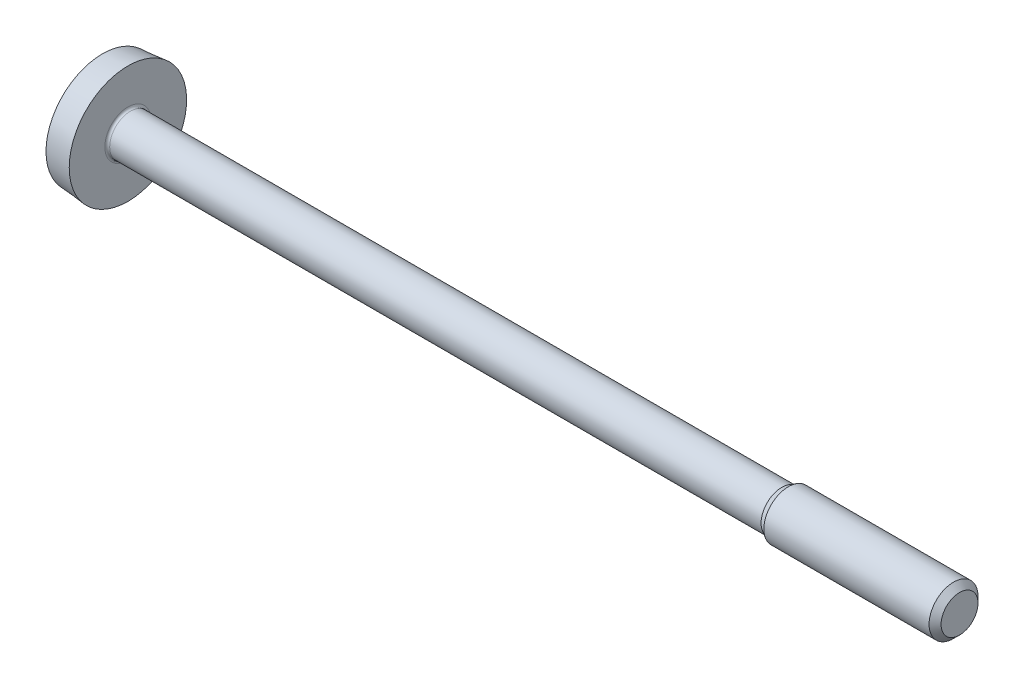
ISO-10303-21;
HEADER;
FILE_DESCRIPTION(('STEP AP214'),'2;1');
FILE_NAME('part.step','',(''),(''),'','','');
FILE_SCHEMA(('AUTOMOTIVE_DESIGN { 1 0 10303 214 1 1 1 1 }'));
ENDSEC;
DATA;
#1=APPLICATION_CONTEXT('core data for automotive mechanical design processes');
#2=APPLICATION_PROTOCOL_DEFINITION('international standard','automotive_design',2000,#1);
#3=PRODUCT_CONTEXT('',#1,'mechanical');
#4=PRODUCT('Part','Part','',(#3));
#5=PRODUCT_RELATED_PRODUCT_CATEGORY('part','',(#4));
#6=PRODUCT_DEFINITION_FORMATION('','',#4);
#7=PRODUCT_DEFINITION_CONTEXT('part definition',#1,'design');
#8=PRODUCT_DEFINITION('design','',#6,#7);
#9=PRODUCT_DEFINITION_SHAPE('','',#8);
#10=(LENGTH_UNIT() NAMED_UNIT(*) SI_UNIT(.MILLI.,.METRE.));
#11=(NAMED_UNIT(*) PLANE_ANGLE_UNIT() SI_UNIT($,.RADIAN.));
#12=(NAMED_UNIT(*) SI_UNIT($,.STERADIAN.) SOLID_ANGLE_UNIT());
#13=UNCERTAINTY_MEASURE_WITH_UNIT(LENGTH_MEASURE(1.E-05),#10,'distance_accuracy_value','');
#14=(GEOMETRIC_REPRESENTATION_CONTEXT(3) GLOBAL_UNCERTAINTY_ASSIGNED_CONTEXT((#13)) GLOBAL_UNIT_ASSIGNED_CONTEXT((#10,
#11,#12)) REPRESENTATION_CONTEXT('',''));
#15=CARTESIAN_POINT('',(0.,0.,0.));
#16=DIRECTION('',(0.,0.,1.));
#17=DIRECTION('',(1.,0.,0.));
#18=AXIS2_PLACEMENT_3D('',#15,#16,#17);
#19=CARTESIAN_POINT('',(3.44029950540036,2.63786388565723E-13,0.));
#20=DIRECTION('',(-1.,0.,0.));
#21=DIRECTION('',(0.,1.,0.));
#22=AXIS2_PLACEMENT_3D('',#19,#20,#21);
#23=SPHERICAL_SURFACE('',#22,5.04029950540036);
#24=CARTESIAN_POINT('',(3.44029950540036,0.29,0.));
#25=DIRECTION('',(0.,1.,0.));
#26=DIRECTION('',(0.,0.,1.));
#27=AXIS2_PLACEMENT_3D('',#24,#25,#26);
#28=CIRCLE('',#27,5.03194983124228);
#29=CARTESIAN_POINT('',(-1.49128432782597,0.29,-1.));
#30=VERTEX_POINT('',#29);
#31=CARTESIAN_POINT('',(-1.58328677375712,0.29,-0.29));
#32=VERTEX_POINT('',#31);
#33=EDGE_CURVE('E11',#30,#32,#28,.T.);
#34=ORIENTED_EDGE('',*,*,#33,.T.);
#35=CARTESIAN_POINT('',(3.44029950540036,2.63786388565723E-13,-0.29));
#36=DIRECTION('',(0.,0.,-1.));
#37=DIRECTION('',(-1.,0.,0.));
#38=AXIS2_PLACEMENT_3D('',#35,#36,#37);
#39=CIRCLE('',#38,5.03194983124227);
#40=CARTESIAN_POINT('',(-1.04,2.29072814756566,-0.29));
#41=VERTEX_POINT('',#40);
#42=EDGE_CURVE('E178',#32,#41,#39,.T.);
#43=ORIENTED_EDGE('',*,*,#42,.T.);
#44=CARTESIAN_POINT('',(-1.04,0.,0.));
#45=DIRECTION('',(-1.,0.,0.));
#46=DIRECTION('',(0.,0.,1.));
#47=AXIS2_PLACEMENT_3D('',#44,#45,#46);
#48=CIRCLE('',#47,2.309011789933);
#49=CARTESIAN_POINT('',(-1.04,-2.29072814756566,-0.29));
#50=VERTEX_POINT('',#49);
#51=EDGE_CURVE('E208',#41,#50,#48,.T.);
#52=ORIENTED_EDGE('',*,*,#51,.T.);
#53=CARTESIAN_POINT('',(3.44029950540036,2.63786388565723E-13,-0.29));
#54=DIRECTION('',(0.,0.,-1.));
#55=DIRECTION('',(-1.,0.,0.));
#56=AXIS2_PLACEMENT_3D('',#53,#54,#55);
#57=CIRCLE('',#56,5.03194983124227);
#58=CARTESIAN_POINT('',(-1.58328677375709,-0.29,-0.29));
#59=VERTEX_POINT('',#58);
#60=EDGE_CURVE('E175',#50,#59,#57,.T.);
#61=ORIENTED_EDGE('',*,*,#60,.T.);
#62=CARTESIAN_POINT('',(3.44029950540036,-0.29,0.));
#63=DIRECTION('',(0.,-1.,0.));
#64=DIRECTION('',(0.,0.,-1.));
#65=AXIS2_PLACEMENT_3D('',#62,#63,#64);
#66=CIRCLE('',#65,5.03194983124225);
#67=CARTESIAN_POINT('',(-1.49128432782594,-0.29,-1.));
#68=VERTEX_POINT('',#67);
#69=EDGE_CURVE('E215',#59,#68,#66,.T.);
#70=ORIENTED_EDGE('',*,*,#69,.T.);
#71=CARTESIAN_POINT('',(3.44029950540036,2.63786388565723E-13,-1.));
#72=DIRECTION('',(0.,0.,-1.));
#73=DIRECTION('',(-1.,0.,0.));
#74=AXIS2_PLACEMENT_3D('',#71,#72,#73);
#75=CIRCLE('',#74,4.94010314711536);
#76=EDGE_CURVE('E44',#68,#30,#75,.T.);
#77=ORIENTED_EDGE('',*,*,#76,.T.);
#78=EDGE_LOOP('',(#34,#43,#52,#61,#70,#77));
#79=FACE_BOUND('',#78,.T.);
#80=ADVANCED_FACE('F36',(#79),#23,.T.);
#81=CARTESIAN_POINT('',(-1.04,-2.29072814756566,0.29));
#82=VERTEX_POINT('',#81);
#83=CARTESIAN_POINT('',(-1.04,2.29072814756566,0.29));
#84=VERTEX_POINT('',#83);
#85=EDGE_CURVE('E205',#82,#84,#48,.T.);
#86=ORIENTED_EDGE('',*,*,#85,.T.);
#87=CARTESIAN_POINT('',(3.44029950540036,2.63786388565723E-13,0.29));
#88=DIRECTION('',(0.,0.,1.));
#89=DIRECTION('',(1.,0.,0.));
#90=AXIS2_PLACEMENT_3D('',#87,#88,#89);
#91=CIRCLE('',#90,5.03194983124227);
#92=CARTESIAN_POINT('',(-1.58328677375712,0.29,0.29));
#93=VERTEX_POINT('',#92);
#94=EDGE_CURVE('E181',#84,#93,#91,.T.);
#95=ORIENTED_EDGE('',*,*,#94,.T.);
#96=CARTESIAN_POINT('',(3.44029950540036,0.29,0.));
#97=DIRECTION('',(0.,1.,0.));
#98=DIRECTION('',(0.,0.,1.));
#99=AXIS2_PLACEMENT_3D('',#96,#97,#98);
#100=CIRCLE('',#99,5.03194983124228);
#101=CARTESIAN_POINT('',(-1.49128432782597,0.29,1.));
#102=VERTEX_POINT('',#101);
#103=EDGE_CURVE('E213',#93,#102,#100,.T.);
#104=ORIENTED_EDGE('',*,*,#103,.T.);
#105=CARTESIAN_POINT('',(3.44029950540036,2.63786388565723E-13,1.));
#106=DIRECTION('',(0.,0.,1.));
#107=DIRECTION('',(1.,0.,0.));
#108=AXIS2_PLACEMENT_3D('',#105,#106,#107);
#109=CIRCLE('',#108,4.94010314711536);
#110=CARTESIAN_POINT('',(-1.49128432782593,-0.29,1.));
#111=VERTEX_POINT('',#110);
#112=EDGE_CURVE('E119',#102,#111,#109,.T.);
#113=ORIENTED_EDGE('',*,*,#112,.T.);
#114=CARTESIAN_POINT('',(3.44029950540036,-0.29,0.));
#115=DIRECTION('',(0.,-1.,0.));
#116=DIRECTION('',(0.,0.,-1.));
#117=AXIS2_PLACEMENT_3D('',#114,#115,#116);
#118=CIRCLE('',#117,5.03194983124225);
#119=CARTESIAN_POINT('',(-1.58328677375709,-0.29,0.29));
#120=VERTEX_POINT('',#119);
#121=EDGE_CURVE('E210',#111,#120,#118,.T.);
#122=ORIENTED_EDGE('',*,*,#121,.T.);
#123=CARTESIAN_POINT('',(3.44029950540036,2.63786388565723E-13,0.29));
#124=DIRECTION('',(0.,0.,1.));
#125=DIRECTION('',(1.,0.,0.));
#126=AXIS2_PLACEMENT_3D('',#123,#124,#125);
#127=CIRCLE('',#126,5.03194983124227);
#128=EDGE_CURVE('E161',#120,#82,#127,.T.);
#129=ORIENTED_EDGE('',*,*,#128,.T.);
#130=EDGE_LOOP('',(#86,#95,#104,#113,#122,#129));
#131=FACE_BOUND('',#130,.T.);
#132=ADVANCED_FACE('F38',(#131),#23,.T.);
#133=CARTESIAN_POINT('',(0.,0.,0.));
#134=DIRECTION('',(1.,0.,0.));
#135=DIRECTION('',(0.,0.,-1.));
#136=AXIS2_PLACEMENT_3D('',#133,#134,#135);
#137=CONICAL_SURFACE('',#136,2.4,0.0872664625997538);
#138=EDGE_CURVE('E206',#84,#41,#48,.T.);
#139=ORIENTED_EDGE('',*,*,#138,.F.);
#140=ORIENTED_EDGE('',*,*,#85,.F.);
#141=EDGE_CURVE('E238',#50,#82,#48,.T.);
#142=ORIENTED_EDGE('',*,*,#141,.F.);
#143=ORIENTED_EDGE('',*,*,#51,.F.);
#144=EDGE_LOOP('',(#139,#140,#142,#143));
#145=FACE_BOUND('',#144,.T.);
#146=CARTESIAN_POINT('',(0.,0.,0.));
#147=DIRECTION('',(-1.,0.,0.));
#148=DIRECTION('',(0.,0.,1.));
#149=AXIS2_PLACEMENT_3D('',#146,#147,#148);
#150=CIRCLE('',#149,2.4);
#151=CARTESIAN_POINT('',(0.,0.,2.4));
#152=VERTEX_POINT('',#151);
#153=EDGE_CURVE('E202',#152,#152,#150,.T.);
#154=ORIENTED_EDGE('',*,*,#153,.T.);
#155=EDGE_LOOP('',(#154));
#156=FACE_BOUND('',#155,.T.);
#157=ADVANCED_FACE('F235',(#145,#156),#137,.T.);
#158=CARTESIAN_POINT('',(0.,2.4,0.));
#159=DIRECTION('',(-1.,0.,0.));
#160=DIRECTION('',(0.,0.,1.));
#161=AXIS2_PLACEMENT_3D('',#158,#159,#160);
#162=PLANE('',#161);
#163=ORIENTED_EDGE('',*,*,#153,.F.);
#164=EDGE_LOOP('',(#163));
#165=FACE_BOUND('',#164,.T.);
#166=CARTESIAN_POINT('',(0.,0.,0.));
#167=DIRECTION('',(-1.,0.,0.));
#168=DIRECTION('',(0.,0.,1.));
#169=AXIS2_PLACEMENT_3D('',#166,#167,#168);
#170=CIRCLE('',#169,0.945);
#171=CARTESIAN_POINT('',(0.,0.,0.945));
#172=VERTEX_POINT('',#171);
#173=EDGE_CURVE('E199',#172,#172,#170,.T.);
#174=ORIENTED_EDGE('',*,*,#173,.T.);
#175=EDGE_LOOP('',(#174));
#176=FACE_BOUND('',#175,.T.);
#177=ADVANCED_FACE('F265',(#165,#176),#162,.F.);
#178=CARTESIAN_POINT('',(0.100000000000008,0.,0.));
#179=DIRECTION('',(-1.,0.,0.));
#180=DIRECTION('',(0.,0.,1.));
#181=AXIS2_PLACEMENT_3D('',#178,#179,#180);
#182=TOROIDAL_SURFACE('',#181,0.945000000000008,0.100000000000008);
#183=ORIENTED_EDGE('',*,*,#173,.F.);
#184=EDGE_LOOP('',(#183));
#185=FACE_BOUND('',#184,.T.);
#186=CARTESIAN_POINT('',(0.100000000000003,0.,0.));
#187=DIRECTION('',(-1.,0.,0.));
#188=DIRECTION('',(0.,0.,1.));
#189=AXIS2_PLACEMENT_3D('',#186,#187,#188);
#190=CIRCLE('',#189,0.845);
#191=CARTESIAN_POINT('',(0.100000000000003,0.,0.845));
#192=VERTEX_POINT('',#191);
#193=EDGE_CURVE('E196',#192,#192,#190,.T.);
#194=ORIENTED_EDGE('',*,*,#193,.T.);
#195=EDGE_LOOP('',(#194));
#196=FACE_BOUND('',#195,.T.);
#197=ADVANCED_FACE('F269',(#185,#196),#182,.F.);
#198=CARTESIAN_POINT('',(34.,0.,0.));
#199=DIRECTION('',(-1.,0.,0.));
#200=DIRECTION('',(0.,0.,1.));
#201=AXIS2_PLACEMENT_3D('',#198,#199,#200);
#202=CYLINDRICAL_SURFACE('',#201,0.845);
#203=ORIENTED_EDGE('',*,*,#193,.F.);
#204=EDGE_LOOP('',(#203));
#205=FACE_BOUND('',#204,.T.);
#206=CARTESIAN_POINT('',(26.731532124827,0.,0.));
#207=DIRECTION('',(-1.,0.,0.));
#208=DIRECTION('',(0.,0.,1.));
#209=AXIS2_PLACEMENT_3D('',#206,#207,#208);
#210=CIRCLE('',#209,0.845);
#211=CARTESIAN_POINT('',(26.731532124827,0.,0.845));
#212=VERTEX_POINT('',#211);
#213=EDGE_CURVE('E193',#212,#212,#210,.T.);
#214=ORIENTED_EDGE('',*,*,#213,.T.);
#215=EDGE_LOOP('',(#214));
#216=FACE_BOUND('',#215,.T.);
#217=ADVANCED_FACE('F275',(#205,#216),#202,.T.);
#218=CARTESIAN_POINT('',(27.,0.,0.));
#219=DIRECTION('',(1.,0.,0.));
#220=DIRECTION('',(0.,0.,-1.));
#221=AXIS2_PLACEMENT_3D('',#218,#219,#220);
#222=CONICAL_SURFACE('',#221,1.,0.523598775598586);
#223=ORIENTED_EDGE('',*,*,#213,.F.);
#224=EDGE_LOOP('',(#223));
#225=FACE_BOUND('',#224,.T.);
#226=CARTESIAN_POINT('',(27.,0.,0.));
#227=DIRECTION('',(-1.,0.,0.));
#228=DIRECTION('',(0.,0.,1.));
#229=AXIS2_PLACEMENT_3D('',#226,#227,#228);
#230=CIRCLE('',#229,1.);
#231=CARTESIAN_POINT('',(27.,0.,1.));
#232=VERTEX_POINT('',#231);
#233=EDGE_CURVE('E190',#232,#232,#230,.T.);
#234=ORIENTED_EDGE('',*,*,#233,.T.);
#235=EDGE_LOOP('',(#234));
#236=FACE_BOUND('',#235,.T.);
#237=ADVANCED_FACE('F279',(#225,#236),#222,.T.);
#238=CARTESIAN_POINT('',(34.,0.,0.));
#239=DIRECTION('',(-1.,0.,0.));
#240=DIRECTION('',(0.,0.,1.));
#241=AXIS2_PLACEMENT_3D('',#238,#239,#240);
#242=CYLINDRICAL_SURFACE('',#241,1.);
#243=ORIENTED_EDGE('',*,*,#233,.F.);
#244=EDGE_LOOP('',(#243));
#245=FACE_BOUND('',#244,.T.);
#246=CARTESIAN_POINT('',(33.7545,0.,0.));
#247=DIRECTION('',(-1.,0.,0.));
#248=DIRECTION('',(0.,0.,1.));
#249=AXIS2_PLACEMENT_3D('',#246,#247,#248);
#250=CIRCLE('',#249,1.);
#251=CARTESIAN_POINT('',(33.7545,0.,1.));
#252=VERTEX_POINT('',#251);
#253=EDGE_CURVE('E187',#252,#252,#250,.T.);
#254=ORIENTED_EDGE('',*,*,#253,.T.);
#255=EDGE_LOOP('',(#254));
#256=FACE_BOUND('',#255,.T.);
#257=ADVANCED_FACE('F283',(#245,#256),#242,.T.);
#258=CARTESIAN_POINT('',(34.,0.,0.));
#259=DIRECTION('',(-1.,0.,0.));
#260=DIRECTION('',(0.,0.,1.));
#261=AXIS2_PLACEMENT_3D('',#258,#259,#260);
#262=CONICAL_SURFACE('',#261,0.7545,0.785398163397443);
#263=ORIENTED_EDGE('',*,*,#253,.F.);
#264=EDGE_LOOP('',(#263));
#265=FACE_BOUND('',#264,.T.);
#266=CARTESIAN_POINT('',(34.,0.,0.));
#267=DIRECTION('',(-1.,0.,0.));
#268=DIRECTION('',(0.,0.,1.));
#269=AXIS2_PLACEMENT_3D('',#266,#267,#268);
#270=CIRCLE('',#269,0.7545);
#271=CARTESIAN_POINT('',(34.,0.,0.7545));
#272=VERTEX_POINT('',#271);
#273=EDGE_CURVE('E184',#272,#272,#270,.T.);
#274=ORIENTED_EDGE('',*,*,#273,.T.);
#275=EDGE_LOOP('',(#274));
#276=FACE_BOUND('',#275,.T.);
#277=ADVANCED_FACE('F287',(#265,#276),#262,.T.);
#278=CARTESIAN_POINT('',(34.,0.7545,0.));
#279=DIRECTION('',(-1.,0.,0.));
#280=DIRECTION('',(0.,0.,1.));
#281=AXIS2_PLACEMENT_3D('',#278,#279,#280);
#282=PLANE('',#281);
#283=ORIENTED_EDGE('',*,*,#273,.F.);
#284=EDGE_LOOP('',(#283));
#285=FACE_BOUND('',#284,.T.);
#286=ADVANCED_FACE('F291',(#285),#282,.F.);
#287=CARTESIAN_POINT('',(-1.64,0.29,0.29));
#288=DIRECTION('',(0.,1.,0.));
#289=DIRECTION('',(0.,0.,1.));
#290=AXIS2_PLACEMENT_3D('',#287,#288,#289);
#291=PLANE('',#290);
#292=DIRECTION('',(1.,0.,0.));
#293=VECTOR('',#292,1.);
#294=CARTESIAN_POINT('',(-1.64,0.29,0.29));
#295=LINE('',#294,#293);
#296=CARTESIAN_POINT('',(-1.04,0.29,0.29));
#297=VERTEX_POINT('',#296);
#298=EDGE_CURVE('E138',#93,#297,#295,.T.);
#299=ORIENTED_EDGE('',*,*,#298,.T.);
#300=DIRECTION('',(0.,0.,1.));
#301=VECTOR('',#300,1.);
#302=CARTESIAN_POINT('',(-1.04,0.29,0.29));
#303=LINE('',#302,#301);
#304=CARTESIAN_POINT('',(-1.04,0.29,1.));
#305=VERTEX_POINT('',#304);
#306=EDGE_CURVE('E131',#297,#305,#303,.T.);
#307=ORIENTED_EDGE('',*,*,#306,.T.);
#308=DIRECTION('',(1.,0.,0.));
#309=VECTOR('',#308,1.);
#310=CARTESIAN_POINT('',(-1.64,0.29,1.));
#311=LINE('',#310,#309);
#312=EDGE_CURVE('E113',#102,#305,#311,.T.);
#313=ORIENTED_EDGE('',*,*,#312,.F.);
#314=ORIENTED_EDGE('',*,*,#103,.F.);
#315=EDGE_LOOP('',(#299,#307,#313,#314));
#316=FACE_BOUND('',#315,.T.);
#317=ADVANCED_FACE('F136',(#316),#291,.F.);
#318=CARTESIAN_POINT('',(-1.64,0.29,-1.));
#319=DIRECTION('',(0.,1.,0.));
#320=DIRECTION('',(0.,0.,1.));
#321=AXIS2_PLACEMENT_3D('',#318,#319,#320);
#322=PLANE('',#321);
#323=DIRECTION('',(1.,0.,0.));
#324=VECTOR('',#323,1.);
#325=CARTESIAN_POINT('',(-1.64,0.29,-1.));
#326=LINE('',#325,#324);
#327=CARTESIAN_POINT('',(-1.04,0.29,-1.));
#328=VERTEX_POINT('',#327);
#329=EDGE_CURVE('E164',#30,#328,#326,.T.);
#330=ORIENTED_EDGE('',*,*,#329,.T.);
#331=DIRECTION('',(0.,0.,1.));
#332=VECTOR('',#331,1.);
#333=CARTESIAN_POINT('',(-1.04,0.29,-1.));
#334=LINE('',#333,#332);
#335=CARTESIAN_POINT('',(-1.04,0.29,-0.29));
#336=VERTEX_POINT('',#335);
#337=EDGE_CURVE('E153',#328,#336,#334,.T.);
#338=ORIENTED_EDGE('',*,*,#337,.T.);
#339=DIRECTION('',(1.,0.,0.));
#340=VECTOR('',#339,1.);
#341=CARTESIAN_POINT('',(-1.64,0.29,-0.29));
#342=LINE('',#341,#340);
#343=EDGE_CURVE('E162',#32,#336,#342,.T.);
#344=ORIENTED_EDGE('',*,*,#343,.F.);
#345=ORIENTED_EDGE('',*,*,#33,.F.);
#346=EDGE_LOOP('',(#330,#338,#344,#345));
#347=FACE_BOUND('',#346,.T.);
#348=ADVANCED_FACE('F227',(#347),#322,.F.);
#349=CARTESIAN_POINT('',(-1.64,-0.29,-1.));
#350=DIRECTION('',(0.,0.,-1.));
#351=DIRECTION('',(-1.,0.,0.));
#352=AXIS2_PLACEMENT_3D('',#349,#350,#351);
#353=PLANE('',#352);
#354=DIRECTION('',(1.,0.,0.));
#355=VECTOR('',#354,1.);
#356=CARTESIAN_POINT('',(-1.64,-0.29,-1.));
#357=LINE('',#356,#355);
#358=CARTESIAN_POINT('',(-1.04,-0.29,-1.));
#359=VERTEX_POINT('',#358);
#360=EDGE_CURVE('E166',#68,#359,#357,.T.);
#361=ORIENTED_EDGE('',*,*,#360,.T.);
#362=DIRECTION('',(0.,1.,0.));
#363=VECTOR('',#362,1.);
#364=CARTESIAN_POINT('',(-1.04,-0.29,-1.));
#365=LINE('',#364,#363);
#366=EDGE_CURVE('E150',#359,#328,#365,.T.);
#367=ORIENTED_EDGE('',*,*,#366,.T.);
#368=ORIENTED_EDGE('',*,*,#329,.F.);
#369=ORIENTED_EDGE('',*,*,#76,.F.);
#370=EDGE_LOOP('',(#361,#367,#368,#369));
#371=FACE_BOUND('',#370,.T.);
#372=ADVANCED_FACE('F221',(#371),#353,.F.);
#373=CARTESIAN_POINT('',(-1.64,-0.29,-0.29));
#374=DIRECTION('',(0.,-1.,0.));
#375=DIRECTION('',(0.,0.,-1.));
#376=AXIS2_PLACEMENT_3D('',#373,#374,#375);
#377=PLANE('',#376);
#378=DIRECTION('',(1.,0.,0.));
#379=VECTOR('',#378,1.);
#380=CARTESIAN_POINT('',(-1.64,-0.29,-0.29));
#381=LINE('',#380,#379);
#382=CARTESIAN_POINT('',(-1.04,-0.29,-0.29));
#383=VERTEX_POINT('',#382);
#384=EDGE_CURVE('E168',#59,#383,#381,.T.);
#385=ORIENTED_EDGE('',*,*,#384,.T.);
#386=DIRECTION('',(0.,0.,-1.));
#387=VECTOR('',#386,1.);
#388=CARTESIAN_POINT('',(-1.04,-0.29,-0.29));
#389=LINE('',#388,#387);
#390=EDGE_CURVE('E147',#383,#359,#389,.T.);
#391=ORIENTED_EDGE('',*,*,#390,.T.);
#392=ORIENTED_EDGE('',*,*,#360,.F.);
#393=ORIENTED_EDGE('',*,*,#69,.F.);
#394=EDGE_LOOP('',(#385,#391,#392,#393));
#395=FACE_BOUND('',#394,.T.);
#396=ADVANCED_FACE('F224',(#395),#377,.F.);
#397=CARTESIAN_POINT('',(-1.64,-0.29,1.));
#398=DIRECTION('',(0.,-1.,0.));
#399=DIRECTION('',(0.,0.,-1.));
#400=AXIS2_PLACEMENT_3D('',#397,#398,#399);
#401=PLANE('',#400);
#402=DIRECTION('',(1.,0.,0.));
#403=VECTOR('',#402,1.);
#404=CARTESIAN_POINT('',(-1.64,-0.29,1.));
#405=LINE('',#404,#403);
#406=CARTESIAN_POINT('',(-1.04,-0.29,1.));
#407=VERTEX_POINT('',#406);
#408=EDGE_CURVE('E123',#111,#407,#405,.T.);
#409=ORIENTED_EDGE('',*,*,#408,.T.);
#410=DIRECTION('',(0.,0.,-1.));
#411=VECTOR('',#410,1.);
#412=CARTESIAN_POINT('',(-1.04,-0.29,1.));
#413=LINE('',#412,#411);
#414=CARTESIAN_POINT('',(-1.04,-0.29,0.29));
#415=VERTEX_POINT('',#414);
#416=EDGE_CURVE('E134',#407,#415,#413,.T.);
#417=ORIENTED_EDGE('',*,*,#416,.T.);
#418=DIRECTION('',(1.,0.,0.));
#419=VECTOR('',#418,1.);
#420=CARTESIAN_POINT('',(-1.64,-0.29,0.29));
#421=LINE('',#420,#419);
#422=EDGE_CURVE('E170',#120,#415,#421,.T.);
#423=ORIENTED_EDGE('',*,*,#422,.F.);
#424=ORIENTED_EDGE('',*,*,#121,.F.);
#425=EDGE_LOOP('',(#409,#417,#423,#424));
#426=FACE_BOUND('',#425,.T.);
#427=ADVANCED_FACE('F245',(#426),#401,.F.);
#428=CARTESIAN_POINT('',(-1.64,0.29,1.));
#429=DIRECTION('',(0.,0.,1.));
#430=DIRECTION('',(1.,0.,0.));
#431=AXIS2_PLACEMENT_3D('',#428,#429,#430);
#432=PLANE('',#431);
#433=ORIENTED_EDGE('',*,*,#312,.T.);
#434=DIRECTION('',(0.,-1.,0.));
#435=VECTOR('',#434,1.);
#436=CARTESIAN_POINT('',(-1.04,0.29,1.));
#437=LINE('',#436,#435);
#438=EDGE_CURVE('E117',#305,#407,#437,.T.);
#439=ORIENTED_EDGE('',*,*,#438,.T.);
#440=ORIENTED_EDGE('',*,*,#408,.F.);
#441=ORIENTED_EDGE('',*,*,#112,.F.);
#442=EDGE_LOOP('',(#433,#439,#440,#441));
#443=FACE_BOUND('',#442,.T.);
#444=ADVANCED_FACE('F115',(#443),#432,.F.);
#445=CARTESIAN_POINT('',(-1.64,2.5,0.29));
#446=DIRECTION('',(0.,0.,1.));
#447=DIRECTION('',(1.,0.,0.));
#448=AXIS2_PLACEMENT_3D('',#445,#446,#447);
#449=PLANE('',#448);
#450=DIRECTION('',(0.,-1.,0.));
#451=VECTOR('',#450,1.);
#452=CARTESIAN_POINT('',(-1.04,2.5,0.29));
#453=LINE('',#452,#451);
#454=EDGE_CURVE('E124',#84,#297,#453,.T.);
#455=ORIENTED_EDGE('',*,*,#454,.T.);
#456=ORIENTED_EDGE('',*,*,#298,.F.);
#457=ORIENTED_EDGE('',*,*,#94,.F.);
#458=EDGE_LOOP('',(#455,#456,#457));
#459=FACE_BOUND('',#458,.T.);
#460=ADVANCED_FACE('F247',(#459),#449,.F.);
#461=CARTESIAN_POINT('',(-1.64,0.29,-0.29));
#462=DIRECTION('',(0.,0.,-1.));
#463=DIRECTION('',(-1.,0.,0.));
#464=AXIS2_PLACEMENT_3D('',#461,#462,#463);
#465=PLANE('',#464);
#466=ORIENTED_EDGE('',*,*,#343,.T.);
#467=DIRECTION('',(0.,1.,0.));
#468=VECTOR('',#467,1.);
#469=CARTESIAN_POINT('',(-1.04,0.29,-0.29));
#470=LINE('',#469,#468);
#471=EDGE_CURVE('E156',#336,#41,#470,.T.);
#472=ORIENTED_EDGE('',*,*,#471,.T.);
#473=ORIENTED_EDGE('',*,*,#42,.F.);
#474=EDGE_LOOP('',(#466,#472,#473));
#475=FACE_BOUND('',#474,.T.);
#476=ADVANCED_FACE('F229',(#475),#465,.F.);
#477=CARTESIAN_POINT('',(-1.64,-2.5,-0.29));
#478=DIRECTION('',(0.,0.,-1.));
#479=DIRECTION('',(-1.,0.,0.));
#480=AXIS2_PLACEMENT_3D('',#477,#478,#479);
#481=PLANE('',#480);
#482=DIRECTION('',(0.,1.,0.));
#483=VECTOR('',#482,1.);
#484=CARTESIAN_POINT('',(-1.04,-2.5,-0.29));
#485=LINE('',#484,#483);
#486=EDGE_CURVE('E51',#50,#383,#485,.T.);
#487=ORIENTED_EDGE('',*,*,#486,.T.);
#488=ORIENTED_EDGE('',*,*,#384,.F.);
#489=ORIENTED_EDGE('',*,*,#60,.F.);
#490=EDGE_LOOP('',(#487,#488,#489));
#491=FACE_BOUND('',#490,.T.);
#492=ADVANCED_FACE('F254',(#491),#481,.F.);
#493=CARTESIAN_POINT('',(-1.64,-0.29,0.29));
#494=DIRECTION('',(0.,0.,1.));
#495=DIRECTION('',(1.,0.,0.));
#496=AXIS2_PLACEMENT_3D('',#493,#494,#495);
#497=PLANE('',#496);
#498=ORIENTED_EDGE('',*,*,#422,.T.);
#499=DIRECTION('',(0.,-1.,0.));
#500=VECTOR('',#499,1.);
#501=CARTESIAN_POINT('',(-1.04,-0.29,0.29));
#502=LINE('',#501,#500);
#503=EDGE_CURVE('E143',#415,#82,#502,.T.);
#504=ORIENTED_EDGE('',*,*,#503,.T.);
#505=ORIENTED_EDGE('',*,*,#128,.F.);
#506=EDGE_LOOP('',(#498,#504,#505));
#507=FACE_BOUND('',#506,.T.);
#508=ADVANCED_FACE('F243',(#507),#497,.F.);
#509=CARTESIAN_POINT('',(-1.04,0.,0.));
#510=DIRECTION('',(1.,0.,0.));
#511=DIRECTION('',(0.,0.,-1.));
#512=AXIS2_PLACEMENT_3D('',#509,#510,#511);
#513=PLANE('',#512);
#514=ORIENTED_EDGE('',*,*,#471,.F.);
#515=ORIENTED_EDGE('',*,*,#337,.F.);
#516=ORIENTED_EDGE('',*,*,#366,.F.);
#517=ORIENTED_EDGE('',*,*,#390,.F.);
#518=ORIENTED_EDGE('',*,*,#486,.F.);
#519=ORIENTED_EDGE('',*,*,#141,.T.);
#520=ORIENTED_EDGE('',*,*,#503,.F.);
#521=ORIENTED_EDGE('',*,*,#416,.F.);
#522=ORIENTED_EDGE('',*,*,#438,.F.);
#523=ORIENTED_EDGE('',*,*,#306,.F.);
#524=ORIENTED_EDGE('',*,*,#454,.F.);
#525=ORIENTED_EDGE('',*,*,#138,.T.);
#526=EDGE_LOOP('',(#514,#515,#516,#517,#518,#519,#520,#521,#522,#523,#524,#525));
#527=FACE_BOUND('',#526,.T.);
#528=ADVANCED_FACE('F129',(#527),#513,.F.);
#529=CLOSED_SHELL('',(#80,#132,#157,#177,#197,#217,#237,#257,#277,#286,#317,#348,#372,#396,#427,
#444,#460,#476,#492,#508,#528));
#530=MANIFOLD_SOLID_BREP('B2',#529);
#531=ADVANCED_BREP_SHAPE_REPRESENTATION('',(#18,#530),#14);
#532=SHAPE_DEFINITION_REPRESENTATION(#9,#531);
ENDSEC;
END-ISO-10303-21;
